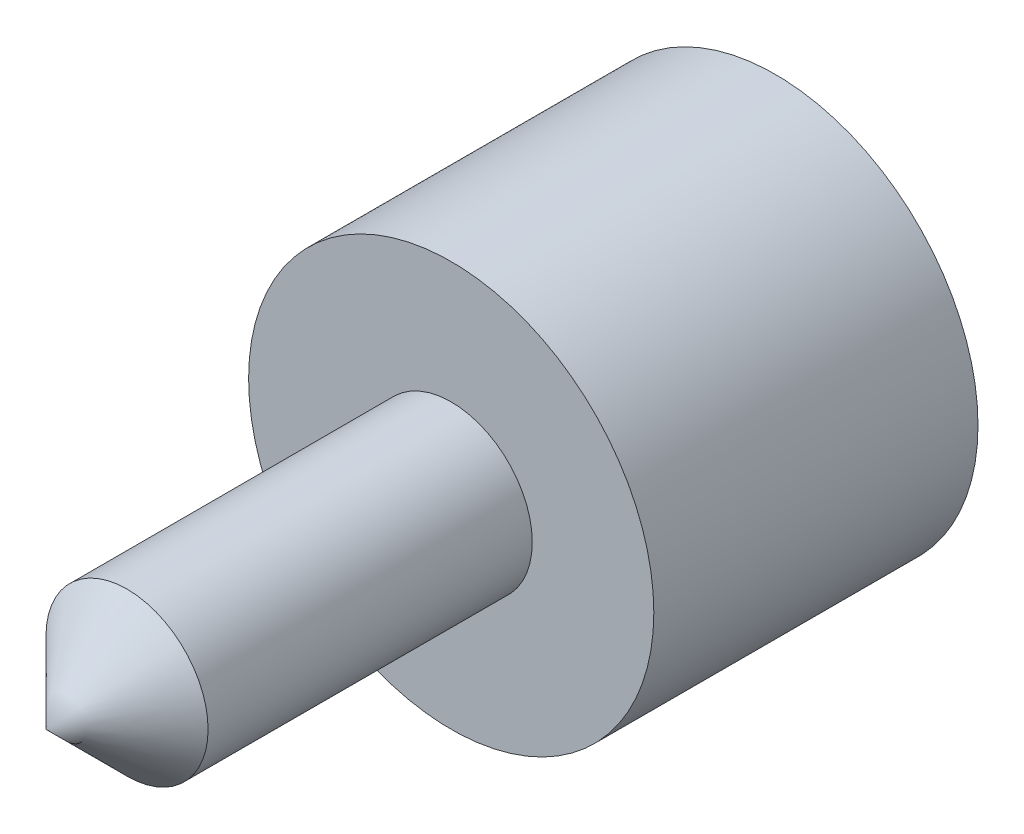
ISO-10303-21;
HEADER;
FILE_DESCRIPTION(('STEP AP214'),'2;1');
FILE_NAME('part.step','',(''),(''),'','','');
FILE_SCHEMA(('AUTOMOTIVE_DESIGN { 1 0 10303 214 1 1 1 1 }'));
ENDSEC;
DATA;
#1=APPLICATION_CONTEXT('core data for automotive mechanical design processes');
#2=APPLICATION_PROTOCOL_DEFINITION('international standard','automotive_design',2000,#1);
#3=PRODUCT_CONTEXT('',#1,'mechanical');
#4=PRODUCT('Part','Part','',(#3));
#5=PRODUCT_RELATED_PRODUCT_CATEGORY('part','',(#4));
#6=PRODUCT_DEFINITION_FORMATION('','',#4);
#7=PRODUCT_DEFINITION_CONTEXT('part definition',#1,'design');
#8=PRODUCT_DEFINITION('design','',#6,#7);
#9=PRODUCT_DEFINITION_SHAPE('','',#8);
#10=(LENGTH_UNIT() NAMED_UNIT(*) SI_UNIT(.MILLI.,.METRE.));
#11=(NAMED_UNIT(*) PLANE_ANGLE_UNIT() SI_UNIT($,.RADIAN.));
#12=(NAMED_UNIT(*) SI_UNIT($,.STERADIAN.) SOLID_ANGLE_UNIT());
#13=UNCERTAINTY_MEASURE_WITH_UNIT(LENGTH_MEASURE(1.E-05),#10,'distance_accuracy_value','');
#14=(GEOMETRIC_REPRESENTATION_CONTEXT(3) GLOBAL_UNCERTAINTY_ASSIGNED_CONTEXT((#13)) GLOBAL_UNIT_ASSIGNED_CONTEXT((#10,
#11,#12)) REPRESENTATION_CONTEXT('',''));
#15=CARTESIAN_POINT('',(0.,0.,0.));
#16=DIRECTION('',(0.,0.,1.));
#17=DIRECTION('',(1.,0.,0.));
#18=AXIS2_PLACEMENT_3D('',#15,#16,#17);
#19=CARTESIAN_POINT('',(0.,0.,8.));
#20=DIRECTION('',(0.,0.,-1.));
#21=DIRECTION('',(-1.,0.,0.));
#22=AXIS2_PLACEMENT_3D('',#19,#20,#21);
#23=CYLINDRICAL_SURFACE('',#22,5.);
#24=CARTESIAN_POINT('',(0.,0.,8.));
#25=DIRECTION('',(0.,0.,1.));
#26=DIRECTION('',(1.,0.,0.));
#27=AXIS2_PLACEMENT_3D('',#24,#25,#26);
#28=CIRCLE('',#27,5.);
#29=CARTESIAN_POINT('',(5.,0.,8.));
#30=VERTEX_POINT('',#29);
#31=EDGE_CURVE('E82',#30,#30,#28,.T.);
#32=ORIENTED_EDGE('',*,*,#31,.F.);
#33=EDGE_LOOP('',(#32));
#34=FACE_BOUND('',#33,.T.);
#35=CARTESIAN_POINT('',(0.,0.,0.));
#36=DIRECTION('',(0.,0.,1.));
#37=DIRECTION('',(1.,0.,0.));
#38=AXIS2_PLACEMENT_3D('',#35,#36,#37);
#39=CIRCLE('',#38,5.);
#40=CARTESIAN_POINT('',(5.,0.,0.));
#41=VERTEX_POINT('',#40);
#42=EDGE_CURVE('E78',#41,#41,#39,.T.);
#43=ORIENTED_EDGE('',*,*,#42,.T.);
#44=EDGE_LOOP('',(#43));
#45=FACE_BOUND('',#44,.T.);
#46=ADVANCED_FACE('F32',(#34,#45),#23,.T.);
#47=CARTESIAN_POINT('',(0.,0.,8.));
#48=DIRECTION('',(0.,0.,1.));
#49=DIRECTION('',(1.,0.,0.));
#50=AXIS2_PLACEMENT_3D('',#47,#48,#49);
#51=PLANE('',#50);
#52=CARTESIAN_POINT('',(0.,0.,8.));
#53=DIRECTION('',(0.,0.,1.));
#54=DIRECTION('',(1.,0.,0.));
#55=AXIS2_PLACEMENT_3D('',#52,#53,#54);
#56=CIRCLE('',#55,2.);
#57=CARTESIAN_POINT('',(2.,0.,8.));
#58=VERTEX_POINT('',#57);
#59=EDGE_CURVE('E39',#58,#58,#56,.T.);
#60=ORIENTED_EDGE('',*,*,#59,.F.);
#61=EDGE_LOOP('',(#60));
#62=FACE_BOUND('',#61,.T.);
#63=ORIENTED_EDGE('',*,*,#31,.T.);
#64=EDGE_LOOP('',(#63));
#65=FACE_BOUND('',#64,.T.);
#66=ADVANCED_FACE('F53',(#62,#65),#51,.T.);
#67=CARTESIAN_POINT('',(0.,0.,0.));
#68=DIRECTION('',(0.,0.,1.));
#69=DIRECTION('',(1.,0.,0.));
#70=AXIS2_PLACEMENT_3D('',#67,#68,#69);
#71=PLANE('',#70);
#72=CARTESIAN_POINT('',(0.,0.,0.));
#73=DIRECTION('',(0.,0.,-1.));
#74=DIRECTION('',(-1.,0.,0.));
#75=AXIS2_PLACEMENT_3D('',#72,#73,#74);
#76=CIRCLE('',#75,1.25);
#77=CARTESIAN_POINT('',(-1.25,0.,0.));
#78=VERTEX_POINT('',#77);
#79=EDGE_CURVE('E79',#78,#78,#76,.T.);
#80=ORIENTED_EDGE('',*,*,#79,.F.);
#81=EDGE_LOOP('',(#80));
#82=FACE_BOUND('',#81,.T.);
#83=ORIENTED_EDGE('',*,*,#42,.F.);
#84=EDGE_LOOP('',(#83));
#85=FACE_BOUND('',#84,.T.);
#86=ADVANCED_FACE('F58',(#82,#85),#71,.F.);
#87=CARTESIAN_POINT('',(0.,0.,6.));
#88=DIRECTION('',(0.,0.,-1.));
#89=DIRECTION('',(-1.,0.,0.));
#90=AXIS2_PLACEMENT_3D('',#87,#88,#89);
#91=CYLINDRICAL_SURFACE('',#90,1.25);
#92=CARTESIAN_POINT('',(0.,0.,6.));
#93=DIRECTION('',(0.,0.,-1.));
#94=DIRECTION('',(-1.,0.,0.));
#95=AXIS2_PLACEMENT_3D('',#92,#93,#94);
#96=CIRCLE('',#95,1.25);
#97=CARTESIAN_POINT('',(-1.25,0.,6.));
#98=VERTEX_POINT('',#97);
#99=EDGE_CURVE('E77',#98,#98,#96,.T.);
#100=ORIENTED_EDGE('',*,*,#99,.F.);
#101=EDGE_LOOP('',(#100));
#102=FACE_BOUND('',#101,.T.);
#103=ORIENTED_EDGE('',*,*,#79,.T.);
#104=EDGE_LOOP('',(#103));
#105=FACE_BOUND('',#104,.T.);
#106=ADVANCED_FACE('F65',(#102,#105),#91,.F.);
#107=CARTESIAN_POINT('',(0.,0.,6.));
#108=DIRECTION('',(0.,0.,-1.));
#109=DIRECTION('',(-1.,0.,0.));
#110=AXIS2_PLACEMENT_3D('',#107,#108,#109);
#111=PLANE('',#110);
#112=ORIENTED_EDGE('',*,*,#99,.T.);
#113=EDGE_LOOP('',(#112));
#114=FACE_BOUND('',#113,.T.);
#115=ADVANCED_FACE('F48',(#114),#111,.T.);
#116=CARTESIAN_POINT('',(0.,0.,18.));
#117=DIRECTION('',(0.,0.,-1.));
#118=DIRECTION('',(-1.,0.,0.));
#119=AXIS2_PLACEMENT_3D('',#116,#117,#118);
#120=CYLINDRICAL_SURFACE('',#119,2.);
#121=CARTESIAN_POINT('',(0.,0.,16.));
#122=DIRECTION('',(0.,0.,1.));
#123=DIRECTION('',(1.,0.,0.));
#124=AXIS2_PLACEMENT_3D('',#121,#122,#123);
#125=CIRCLE('',#124,2.);
#126=CARTESIAN_POINT('',(2.,0.,16.));
#127=VERTEX_POINT('',#126);
#128=EDGE_CURVE('E11',#127,#127,#125,.F.);
#129=ORIENTED_EDGE('',*,*,#128,.T.);
#130=EDGE_LOOP('',(#129));
#131=FACE_BOUND('',#130,.T.);
#132=ORIENTED_EDGE('',*,*,#59,.T.);
#133=EDGE_LOOP('',(#132));
#134=FACE_BOUND('',#133,.T.);
#135=ADVANCED_FACE('F43',(#131,#134),#120,.T.);
#136=CARTESIAN_POINT('',(0.,0.,16.));
#137=DIRECTION('',(0.,0.,-1.));
#138=DIRECTION('',(-1.,0.,0.));
#139=AXIS2_PLACEMENT_3D('',#136,#137,#138);
#140=CONICAL_SURFACE('',#139,2.,0.785398163397447);
#141=ORIENTED_EDGE('',*,*,#128,.F.);
#142=EDGE_LOOP('',(#141));
#143=FACE_BOUND('',#142,.T.);
#144=CARTESIAN_POINT('',(0.,0.,18.));
#145=VERTEX_POINT('',#144);
#146=VERTEX_LOOP('',#145);
#147=FACE_BOUND('',#146,.T.);
#148=ADVANCED_FACE('F34',(#143,#147),#140,.T.);
#149=CLOSED_SHELL('',(#46,#66,#86,#106,#115,#135,#148));
#150=MANIFOLD_SOLID_BREP('B2',#149);
#151=ADVANCED_BREP_SHAPE_REPRESENTATION('',(#18,#150),#14);
#152=SHAPE_DEFINITION_REPRESENTATION(#9,#151);
ENDSEC;
END-ISO-10303-21;
